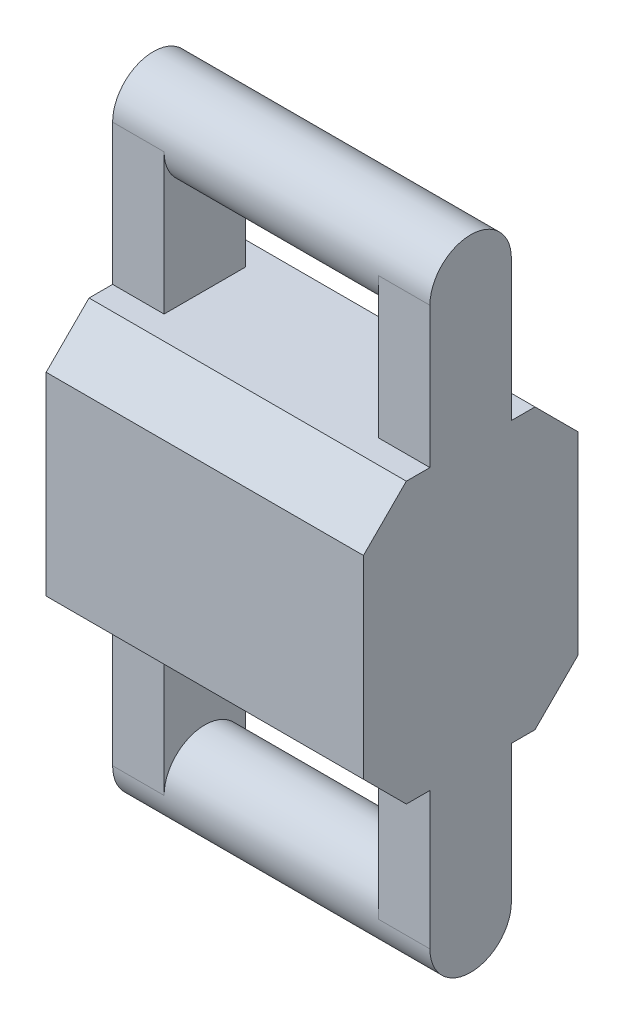
ISO-10303-21;
HEADER;
FILE_DESCRIPTION(('STEP AP214'),'2;1');
FILE_NAME('part.step','',(''),(''),'','','');
FILE_SCHEMA(('AUTOMOTIVE_DESIGN { 1 0 10303 214 1 1 1 1 }'));
ENDSEC;
DATA;
#1=APPLICATION_CONTEXT('core data for automotive mechanical design processes');
#2=APPLICATION_PROTOCOL_DEFINITION('international standard','automotive_design',2000,#1);
#3=PRODUCT_CONTEXT('',#1,'mechanical');
#4=PRODUCT('Part','Part','',(#3));
#5=PRODUCT_RELATED_PRODUCT_CATEGORY('part','',(#4));
#6=PRODUCT_DEFINITION_FORMATION('','',#4);
#7=PRODUCT_DEFINITION_CONTEXT('part definition',#1,'design');
#8=PRODUCT_DEFINITION('design','',#6,#7);
#9=PRODUCT_DEFINITION_SHAPE('','',#8);
#10=(LENGTH_UNIT() NAMED_UNIT(*) SI_UNIT(.MILLI.,.METRE.));
#11=(NAMED_UNIT(*) PLANE_ANGLE_UNIT() SI_UNIT($,.RADIAN.));
#12=(NAMED_UNIT(*) SI_UNIT($,.STERADIAN.) SOLID_ANGLE_UNIT());
#13=UNCERTAINTY_MEASURE_WITH_UNIT(LENGTH_MEASURE(1.E-05),#10,'distance_accuracy_value','');
#14=(GEOMETRIC_REPRESENTATION_CONTEXT(3) GLOBAL_UNCERTAINTY_ASSIGNED_CONTEXT((#13)) GLOBAL_UNIT_ASSIGNED_CONTEXT((#10,
#11,#12)) REPRESENTATION_CONTEXT('',''));
#15=CARTESIAN_POINT('',(0.,0.,0.));
#16=DIRECTION('',(0.,0.,1.));
#17=DIRECTION('',(1.,0.,0.));
#18=AXIS2_PLACEMENT_3D('',#15,#16,#17);
#19=CARTESIAN_POINT('',(5.,0.,3.1));
#20=DIRECTION('',(0.,0.,1.));
#21=DIRECTION('',(1.,0.,0.));
#22=AXIS2_PLACEMENT_3D('',#19,#20,#21);
#23=PLANE('',#22);
#24=DIRECTION('',(0.,1.,0.));
#25=VECTOR('',#24,1.);
#26=CARTESIAN_POINT('',(-5.,0.,3.1));
#27=LINE('',#26,#25);
#28=CARTESIAN_POINT('',(-5.,0.,3.1));
#29=VERTEX_POINT('',#28);
#30=CARTESIAN_POINT('',(-5.,6.40324153852321,3.1));
#31=VERTEX_POINT('',#30);
#32=EDGE_CURVE('E621',#29,#31,#27,.T.);
#33=ORIENTED_EDGE('',*,*,#32,.F.);
#34=DIRECTION('',(1.,0.,0.));
#35=VECTOR('',#34,1.);
#36=CARTESIAN_POINT('',(-7.4,0.,3.1));
#37=LINE('',#36,#35);
#38=CARTESIAN_POINT('',(-7.4,0.,3.1));
#39=VERTEX_POINT('',#38);
#40=EDGE_CURVE('E441',#39,#29,#37,.T.);
#41=ORIENTED_EDGE('',*,*,#40,.F.);
#42=DIRECTION('',(0.,-1.,0.));
#43=VECTOR('',#42,1.);
#44=CARTESIAN_POINT('',(-7.4,6.40324153852321,3.1));
#45=LINE('',#44,#43);
#46=CARTESIAN_POINT('',(-7.4,6.40324153852321,3.1));
#47=VERTEX_POINT('',#46);
#48=EDGE_CURVE('E402',#47,#39,#45,.T.);
#49=ORIENTED_EDGE('',*,*,#48,.F.);
#50=DIRECTION('',(-1.,0.,0.));
#51=VECTOR('',#50,1.);
#52=CARTESIAN_POINT('',(-2.6,6.40324153852321,3.1));
#53=LINE('',#52,#51);
#54=EDGE_CURVE('E449',#31,#47,#53,.T.);
#55=ORIENTED_EDGE('',*,*,#54,.F.);
#56=EDGE_LOOP('',(#33,#41,#49,#55));
#57=FACE_BOUND('',#56,.T.);
#58=ADVANCED_FACE('F108',(#57),#23,.F.);
#59=CARTESIAN_POINT('',(5.,0.,6.9));
#60=DIRECTION('',(0.,0.,-1.));
#61=DIRECTION('',(-1.,0.,0.));
#62=AXIS2_PLACEMENT_3D('',#59,#60,#61);
#63=PLANE('',#62);
#64=DIRECTION('',(0.,-1.,0.));
#65=VECTOR('',#64,1.);
#66=CARTESIAN_POINT('',(-5.,26.,6.9));
#67=LINE('',#66,#65);
#68=CARTESIAN_POINT('',(-5.,26.,6.9));
#69=VERTEX_POINT('',#68);
#70=CARTESIAN_POINT('',(-5.,19.4450929238287,6.9));
#71=VERTEX_POINT('',#70);
#72=EDGE_CURVE('E650',#69,#71,#67,.T.);
#73=ORIENTED_EDGE('',*,*,#72,.F.);
#74=DIRECTION('',(1.,0.,0.));
#75=VECTOR('',#74,1.);
#76=CARTESIAN_POINT('',(-7.4,26.,6.9));
#77=LINE('',#76,#75);
#78=CARTESIAN_POINT('',(-7.4,26.,6.9));
#79=VERTEX_POINT('',#78);
#80=EDGE_CURVE('E433',#79,#69,#77,.T.);
#81=ORIENTED_EDGE('',*,*,#80,.F.);
#82=DIRECTION('',(0.,1.,0.));
#83=VECTOR('',#82,1.);
#84=CARTESIAN_POINT('',(-7.4,19.4450929238287,6.9));
#85=LINE('',#84,#83);
#86=CARTESIAN_POINT('',(-7.4,19.4450929238287,6.9));
#87=VERTEX_POINT('',#86);
#88=EDGE_CURVE('E125',#87,#79,#85,.T.);
#89=ORIENTED_EDGE('',*,*,#88,.F.);
#90=DIRECTION('',(-1.,0.,0.));
#91=VECTOR('',#90,1.);
#92=CARTESIAN_POINT('',(-2.6,19.4450929238287,6.9));
#93=LINE('',#92,#91);
#94=EDGE_CURVE('E133',#71,#87,#93,.T.);
#95=ORIENTED_EDGE('',*,*,#94,.F.);
#96=EDGE_LOOP('',(#73,#81,#89,#95));
#97=FACE_BOUND('',#96,.T.);
#98=ADVANCED_FACE('F564',(#97),#63,.F.);
#99=CARTESIAN_POINT('',(5.,0.,6.9));
#100=DIRECTION('',(0.,0.,1.));
#101=DIRECTION('',(1.,0.,0.));
#102=AXIS2_PLACEMENT_3D('',#99,#100,#101);
#103=PLANE('',#102);
#104=DIRECTION('',(1.,0.,0.));
#105=VECTOR('',#104,1.);
#106=CARTESIAN_POINT('',(-7.4,0.,6.9));
#107=LINE('',#106,#105);
#108=CARTESIAN_POINT('',(-7.4,0.,6.9));
#109=VERTEX_POINT('',#108);
#110=CARTESIAN_POINT('',(-5.,0.,6.9));
#111=VERTEX_POINT('',#110);
#112=EDGE_CURVE('E437',#109,#111,#107,.T.);
#113=ORIENTED_EDGE('',*,*,#112,.T.);
#114=DIRECTION('',(0.,-1.,0.));
#115=VECTOR('',#114,1.);
#116=CARTESIAN_POINT('',(-5.,6.40324153852321,6.9));
#117=LINE('',#116,#115);
#118=CARTESIAN_POINT('',(-5.,6.40324153852321,6.9));
#119=VERTEX_POINT('',#118);
#120=EDGE_CURVE('E624',#119,#111,#117,.T.);
#121=ORIENTED_EDGE('',*,*,#120,.F.);
#122=DIRECTION('',(1.,0.,0.));
#123=VECTOR('',#122,1.);
#124=CARTESIAN_POINT('',(-5.,6.40324153852321,6.9));
#125=LINE('',#124,#123);
#126=CARTESIAN_POINT('',(-7.4,6.40324153852321,6.9));
#127=VERTEX_POINT('',#126);
#128=EDGE_CURVE('E453',#127,#119,#125,.T.);
#129=ORIENTED_EDGE('',*,*,#128,.F.);
#130=DIRECTION('',(0.,1.,0.));
#131=VECTOR('',#130,1.);
#132=CARTESIAN_POINT('',(-7.4,0.,6.9));
#133=LINE('',#132,#131);
#134=EDGE_CURVE('E408',#109,#127,#133,.T.);
#135=ORIENTED_EDGE('',*,*,#134,.F.);
#136=EDGE_LOOP('',(#113,#121,#129,#135));
#137=FACE_BOUND('',#136,.T.);
#138=ADVANCED_FACE('F571',(#137),#103,.T.);
#139=CARTESIAN_POINT('',(5.,0.,3.1));
#140=DIRECTION('',(0.,0.,-1.));
#141=DIRECTION('',(-1.,0.,0.));
#142=AXIS2_PLACEMENT_3D('',#139,#140,#141);
#143=PLANE('',#142);
#144=DIRECTION('',(1.,0.,0.));
#145=VECTOR('',#144,1.);
#146=CARTESIAN_POINT('',(-7.4,26.,3.1));
#147=LINE('',#146,#145);
#148=CARTESIAN_POINT('',(-7.4,26.,3.1));
#149=VERTEX_POINT('',#148);
#150=CARTESIAN_POINT('',(-5.,26.,3.1));
#151=VERTEX_POINT('',#150);
#152=EDGE_CURVE('E445',#149,#151,#147,.T.);
#153=ORIENTED_EDGE('',*,*,#152,.T.);
#154=DIRECTION('',(0.,1.,0.));
#155=VECTOR('',#154,1.);
#156=CARTESIAN_POINT('',(-5.,19.4450929238287,3.1));
#157=LINE('',#156,#155);
#158=CARTESIAN_POINT('',(-5.,19.4450929238287,3.1));
#159=VERTEX_POINT('',#158);
#160=EDGE_CURVE('E643',#159,#151,#157,.T.);
#161=ORIENTED_EDGE('',*,*,#160,.F.);
#162=DIRECTION('',(1.,0.,0.));
#163=VECTOR('',#162,1.);
#164=CARTESIAN_POINT('',(-5.,19.4450929238287,3.1));
#165=LINE('',#164,#163);
#166=CARTESIAN_POINT('',(-7.4,19.4450929238287,3.1));
#167=VERTEX_POINT('',#166);
#168=EDGE_CURVE('E464',#167,#159,#165,.T.);
#169=ORIENTED_EDGE('',*,*,#168,.F.);
#170=DIRECTION('',(0.,-1.,0.));
#171=VECTOR('',#170,1.);
#172=CARTESIAN_POINT('',(-7.4,26.,3.1));
#173=LINE('',#172,#171);
#174=EDGE_CURVE('E378',#149,#167,#173,.T.);
#175=ORIENTED_EDGE('',*,*,#174,.F.);
#176=EDGE_LOOP('',(#153,#161,#169,#175));
#177=FACE_BOUND('',#176,.T.);
#178=ADVANCED_FACE('F577',(#177),#143,.T.);
#179=DIRECTION('',(0.,-1.,0.));
#180=VECTOR('',#179,1.);
#181=CARTESIAN_POINT('',(5.,6.40324153852321,3.1));
#182=LINE('',#181,#180);
#183=CARTESIAN_POINT('',(5.,6.40324153852321,3.1));
#184=VERTEX_POINT('',#183);
#185=CARTESIAN_POINT('',(5.,0.,3.1));
#186=VERTEX_POINT('',#185);
#187=EDGE_CURVE('E311',#184,#186,#182,.T.);
#188=ORIENTED_EDGE('',*,*,#187,.F.);
#189=DIRECTION('',(-1.,0.,0.));
#190=VECTOR('',#189,1.);
#191=CARTESIAN_POINT('',(5.,6.40324153852321,3.1));
#192=LINE('',#191,#190);
#193=CARTESIAN_POINT('',(7.4,6.40324153852321,3.1));
#194=VERTEX_POINT('',#193);
#195=EDGE_CURVE('E454',#194,#184,#192,.T.);
#196=ORIENTED_EDGE('',*,*,#195,.F.);
#197=DIRECTION('',(0.,1.,0.));
#198=VECTOR('',#197,1.);
#199=CARTESIAN_POINT('',(7.4,0.,3.1));
#200=LINE('',#199,#198);
#201=CARTESIAN_POINT('',(7.4,0.,3.1));
#202=VERTEX_POINT('',#201);
#203=EDGE_CURVE('E341',#202,#194,#200,.T.);
#204=ORIENTED_EDGE('',*,*,#203,.F.);
#205=DIRECTION('',(-1.,0.,0.));
#206=VECTOR('',#205,1.);
#207=CARTESIAN_POINT('',(7.4,0.,3.1));
#208=LINE('',#207,#206);
#209=EDGE_CURVE('E286',#202,#186,#208,.T.);
#210=ORIENTED_EDGE('',*,*,#209,.T.);
#211=EDGE_LOOP('',(#188,#196,#204,#210));
#212=FACE_BOUND('',#211,.T.);
#213=ADVANCED_FACE('F513',(#212),#23,.F.);
#214=DIRECTION('',(0.,1.,0.));
#215=VECTOR('',#214,1.);
#216=CARTESIAN_POINT('',(5.,19.4450929238287,6.9));
#217=LINE('',#216,#215);
#218=CARTESIAN_POINT('',(5.,19.4450929238287,6.9));
#219=VERTEX_POINT('',#218);
#220=CARTESIAN_POINT('',(5.,26.,6.9));
#221=VERTEX_POINT('',#220);
#222=EDGE_CURVE('E295',#219,#221,#217,.T.);
#223=ORIENTED_EDGE('',*,*,#222,.F.);
#224=DIRECTION('',(-1.,0.,0.));
#225=VECTOR('',#224,1.);
#226=CARTESIAN_POINT('',(5.,19.4450929238287,6.9));
#227=LINE('',#226,#225);
#228=CARTESIAN_POINT('',(7.4,19.4450929238287,6.9));
#229=VERTEX_POINT('',#228);
#230=EDGE_CURVE('E458',#229,#219,#227,.T.);
#231=ORIENTED_EDGE('',*,*,#230,.F.);
#232=DIRECTION('',(0.,-1.,0.));
#233=VECTOR('',#232,1.);
#234=CARTESIAN_POINT('',(7.4,26.,6.9));
#235=LINE('',#234,#233);
#236=CARTESIAN_POINT('',(7.4,26.,6.9));
#237=VERTEX_POINT('',#236);
#238=EDGE_CURVE('E310',#237,#229,#235,.T.);
#239=ORIENTED_EDGE('',*,*,#238,.F.);
#240=DIRECTION('',(-1.,0.,0.));
#241=VECTOR('',#240,1.);
#242=CARTESIAN_POINT('',(7.4,26.,6.9));
#243=LINE('',#242,#241);
#244=EDGE_CURVE('E372',#237,#221,#243,.T.);
#245=ORIENTED_EDGE('',*,*,#244,.T.);
#246=EDGE_LOOP('',(#223,#231,#239,#245));
#247=FACE_BOUND('',#246,.T.);
#248=ADVANCED_FACE('F550',(#247),#63,.F.);
#249=DIRECTION('',(1.,0.,0.));
#250=VECTOR('',#249,1.);
#251=CARTESIAN_POINT('',(2.6,6.40324153852321,6.9));
#252=LINE('',#251,#250);
#253=CARTESIAN_POINT('',(5.,6.40324153852321,6.9));
#254=VERTEX_POINT('',#253);
#255=CARTESIAN_POINT('',(7.4,6.40324153852321,6.9));
#256=VERTEX_POINT('',#255);
#257=EDGE_CURVE('E450',#254,#256,#252,.T.);
#258=ORIENTED_EDGE('',*,*,#257,.F.);
#259=DIRECTION('',(0.,1.,0.));
#260=VECTOR('',#259,1.);
#261=CARTESIAN_POINT('',(5.,0.,6.9));
#262=LINE('',#261,#260);
#263=CARTESIAN_POINT('',(5.,0.,6.9));
#264=VERTEX_POINT('',#263);
#265=EDGE_CURVE('E522',#264,#254,#262,.T.);
#266=ORIENTED_EDGE('',*,*,#265,.F.);
#267=DIRECTION('',(-1.,0.,0.));
#268=VECTOR('',#267,1.);
#269=CARTESIAN_POINT('',(7.4,0.,6.9));
#270=LINE('',#269,#268);
#271=CARTESIAN_POINT('',(7.4,0.,6.9));
#272=VERTEX_POINT('',#271);
#273=EDGE_CURVE('E369',#272,#264,#270,.T.);
#274=ORIENTED_EDGE('',*,*,#273,.F.);
#275=DIRECTION('',(0.,-1.,0.));
#276=VECTOR('',#275,1.);
#277=CARTESIAN_POINT('',(7.4,6.40324153852321,6.9));
#278=LINE('',#277,#276);
#279=EDGE_CURVE('E335',#256,#272,#278,.T.);
#280=ORIENTED_EDGE('',*,*,#279,.F.);
#281=EDGE_LOOP('',(#258,#266,#274,#280));
#282=FACE_BOUND('',#281,.T.);
#283=ADVANCED_FACE('F532',(#282),#103,.T.);
#284=DIRECTION('',(1.,0.,0.));
#285=VECTOR('',#284,1.);
#286=CARTESIAN_POINT('',(2.6,19.4450929238287,3.1));
#287=LINE('',#286,#285);
#288=CARTESIAN_POINT('',(5.,19.4450929238287,3.1));
#289=VERTEX_POINT('',#288);
#290=CARTESIAN_POINT('',(7.4,19.4450929238287,3.1));
#291=VERTEX_POINT('',#290);
#292=EDGE_CURVE('E300',#289,#291,#287,.T.);
#293=ORIENTED_EDGE('',*,*,#292,.F.);
#294=DIRECTION('',(0.,-1.,0.));
#295=VECTOR('',#294,1.);
#296=CARTESIAN_POINT('',(5.,26.,3.1));
#297=LINE('',#296,#295);
#298=CARTESIAN_POINT('',(5.,26.,3.1));
#299=VERTEX_POINT('',#298);
#300=EDGE_CURVE('E292',#299,#289,#297,.T.);
#301=ORIENTED_EDGE('',*,*,#300,.F.);
#302=DIRECTION('',(-1.,0.,0.));
#303=VECTOR('',#302,1.);
#304=CARTESIAN_POINT('',(7.4,26.,3.1));
#305=LINE('',#304,#303);
#306=CARTESIAN_POINT('',(7.4,26.,3.1));
#307=VERTEX_POINT('',#306);
#308=EDGE_CURVE('E273',#307,#299,#305,.T.);
#309=ORIENTED_EDGE('',*,*,#308,.F.);
#310=DIRECTION('',(0.,1.,0.));
#311=VECTOR('',#310,1.);
#312=CARTESIAN_POINT('',(7.4,19.4450929238287,3.1));
#313=LINE('',#312,#311);
#314=EDGE_CURVE('E287',#291,#307,#313,.T.);
#315=ORIENTED_EDGE('',*,*,#314,.F.);
#316=EDGE_LOOP('',(#293,#301,#309,#315));
#317=FACE_BOUND('',#316,.T.);
#318=ADVANCED_FACE('F299',(#317),#143,.T.);
#319=CARTESIAN_POINT('',(0.,0.,0.));
#320=DIRECTION('',(0.,0.,1.));
#321=DIRECTION('',(1.,0.,0.));
#322=AXIS2_PLACEMENT_3D('',#319,#320,#321);
#323=PLANE('',#322);
#324=DIRECTION('',(-1.,0.,0.));
#325=VECTOR('',#324,1.);
#326=CARTESIAN_POINT('',(0.,8.40324153852322,0.));
#327=LINE('',#326,#325);
#328=CARTESIAN_POINT('',(7.4,8.40324153852321,0.));
#329=VERTEX_POINT('',#328);
#330=CARTESIAN_POINT('',(-7.4,8.40324153852321,0.));
#331=VERTEX_POINT('',#330);
#332=EDGE_CURVE('E118',#329,#331,#327,.T.);
#333=ORIENTED_EDGE('',*,*,#332,.T.);
#334=DIRECTION('',(0.,-1.,0.));
#335=VECTOR('',#334,1.);
#336=CARTESIAN_POINT('',(-7.4,17.4450929238286,0.));
#337=LINE('',#336,#335);
#338=CARTESIAN_POINT('',(-7.4,17.4450929238286,0.));
#339=VERTEX_POINT('',#338);
#340=EDGE_CURVE('E390',#339,#331,#337,.T.);
#341=ORIENTED_EDGE('',*,*,#340,.F.);
#342=DIRECTION('',(1.,0.,0.));
#343=VECTOR('',#342,1.);
#344=CARTESIAN_POINT('',(5.,17.4450929238286,0.));
#345=LINE('',#344,#343);
#346=CARTESIAN_POINT('',(7.4,17.4450929238286,0.));
#347=VERTEX_POINT('',#346);
#348=EDGE_CURVE('E12',#339,#347,#345,.T.);
#349=ORIENTED_EDGE('',*,*,#348,.T.);
#350=DIRECTION('',(0.,1.,0.));
#351=VECTOR('',#350,1.);
#352=CARTESIAN_POINT('',(7.4,8.40324153852321,0.));
#353=LINE('',#352,#351);
#354=EDGE_CURVE('E353',#329,#347,#353,.T.);
#355=ORIENTED_EDGE('',*,*,#354,.F.);
#356=EDGE_LOOP('',(#333,#341,#349,#355));
#357=FACE_BOUND('',#356,.T.);
#358=ADVANCED_FACE('F496',(#357),#323,.F.);
#359=CARTESIAN_POINT('',(0.,0.,10.));
#360=DIRECTION('',(0.,0.,1.));
#361=DIRECTION('',(1.,0.,0.));
#362=AXIS2_PLACEMENT_3D('',#359,#360,#361);
#363=PLANE('',#362);
#364=DIRECTION('',(-1.,0.,0.));
#365=VECTOR('',#364,1.);
#366=CARTESIAN_POINT('',(0.,17.4450929238286,10.));
#367=LINE('',#366,#365);
#368=CARTESIAN_POINT('',(7.4,17.4450929238286,10.));
#369=VERTEX_POINT('',#368);
#370=CARTESIAN_POINT('',(-7.4,17.4450929238286,10.));
#371=VERTEX_POINT('',#370);
#372=EDGE_CURVE('E481',#369,#371,#367,.T.);
#373=ORIENTED_EDGE('',*,*,#372,.T.);
#374=DIRECTION('',(0.,1.,0.));
#375=VECTOR('',#374,1.);
#376=CARTESIAN_POINT('',(-7.4,8.40324153852321,10.));
#377=LINE('',#376,#375);
#378=CARTESIAN_POINT('',(-7.4,8.40324153852321,10.));
#379=VERTEX_POINT('',#378);
#380=EDGE_CURVE('E420',#379,#371,#377,.T.);
#381=ORIENTED_EDGE('',*,*,#380,.F.);
#382=DIRECTION('',(1.,0.,0.));
#383=VECTOR('',#382,1.);
#384=CARTESIAN_POINT('',(5.,8.40324153852322,10.));
#385=LINE('',#384,#383);
#386=CARTESIAN_POINT('',(7.4,8.40324153852321,10.));
#387=VERTEX_POINT('',#386);
#388=EDGE_CURVE('E484',#379,#387,#385,.T.);
#389=ORIENTED_EDGE('',*,*,#388,.T.);
#390=DIRECTION('',(0.,-1.,0.));
#391=VECTOR('',#390,1.);
#392=CARTESIAN_POINT('',(7.4,17.4450929238286,10.));
#393=LINE('',#392,#391);
#394=EDGE_CURVE('E323',#369,#387,#393,.T.);
#395=ORIENTED_EDGE('',*,*,#394,.F.);
#396=EDGE_LOOP('',(#373,#381,#389,#395));
#397=FACE_BOUND('',#396,.T.);
#398=ADVANCED_FACE('F542',(#397),#363,.T.);
#399=CARTESIAN_POINT('',(5.002,0.,5.));
#400=DIRECTION('',(-1.,0.,0.));
#401=DIRECTION('',(0.,0.,1.));
#402=AXIS2_PLACEMENT_3D('',#399,#400,#401);
#403=CYLINDRICAL_SURFACE('',#402,1.9);
#404=CARTESIAN_POINT('',(-5.,0.,5.));
#405=DIRECTION('',(-1.,0.,0.));
#406=DIRECTION('',(0.,0.,-1.));
#407=AXIS2_PLACEMENT_3D('',#404,#405,#406);
#408=CIRCLE('',#407,1.9);
#409=EDGE_CURVE('E620',#111,#29,#408,.T.);
#410=ORIENTED_EDGE('',*,*,#409,.F.);
#411=ORIENTED_EDGE('',*,*,#112,.F.);
#412=CARTESIAN_POINT('',(-7.4,0.,5.));
#413=DIRECTION('',(-1.,0.,0.));
#414=DIRECTION('',(0.,0.,1.));
#415=AXIS2_PLACEMENT_3D('',#412,#413,#414);
#416=CIRCLE('',#415,1.9);
#417=EDGE_CURVE('E405',#39,#109,#416,.T.);
#418=ORIENTED_EDGE('',*,*,#417,.F.);
#419=ORIENTED_EDGE('',*,*,#40,.T.);
#420=EDGE_LOOP('',(#410,#411,#418,#419));
#421=FACE_BOUND('',#420,.T.);
#422=CARTESIAN_POINT('',(5.,0.,5.));
#423=DIRECTION('',(1.,0.,0.));
#424=DIRECTION('',(0.,0.,1.));
#425=AXIS2_PLACEMENT_3D('',#422,#423,#424);
#426=CIRCLE('',#425,1.9);
#427=EDGE_CURVE('E297',#186,#264,#426,.T.);
#428=ORIENTED_EDGE('',*,*,#427,.F.);
#429=ORIENTED_EDGE('',*,*,#209,.F.);
#430=CARTESIAN_POINT('',(7.4,0.,5.));
#431=DIRECTION('',(1.,0.,0.));
#432=DIRECTION('',(0.,0.,-1.));
#433=AXIS2_PLACEMENT_3D('',#430,#431,#432);
#434=CIRCLE('',#433,1.9);
#435=EDGE_CURVE('E338',#272,#202,#434,.T.);
#436=ORIENTED_EDGE('',*,*,#435,.F.);
#437=ORIENTED_EDGE('',*,*,#273,.T.);
#438=EDGE_LOOP('',(#428,#429,#436,#437));
#439=FACE_BOUND('',#438,.T.);
#440=ADVANCED_FACE('F636',(#421,#439),#403,.T.);
#441=CARTESIAN_POINT('',(-5.002,26.,5.));
#442=DIRECTION('',(1.,0.,0.));
#443=DIRECTION('',(0.,0.,-1.));
#444=AXIS2_PLACEMENT_3D('',#441,#442,#443);
#445=CYLINDRICAL_SURFACE('',#444,1.9);
#446=CARTESIAN_POINT('',(5.,26.,5.));
#447=DIRECTION('',(1.,0.,0.));
#448=DIRECTION('',(0.,0.,1.));
#449=AXIS2_PLACEMENT_3D('',#446,#447,#448);
#450=CIRCLE('',#449,1.9);
#451=EDGE_CURVE('E278',#221,#299,#450,.T.);
#452=ORIENTED_EDGE('',*,*,#451,.F.);
#453=ORIENTED_EDGE('',*,*,#244,.F.);
#454=CARTESIAN_POINT('',(7.4,26.,5.));
#455=DIRECTION('',(1.,0.,0.));
#456=DIRECTION('',(0.,0.,-1.));
#457=AXIS2_PLACEMENT_3D('',#454,#455,#456);
#458=CIRCLE('',#457,1.9);
#459=EDGE_CURVE('E281',#307,#237,#458,.T.);
#460=ORIENTED_EDGE('',*,*,#459,.F.);
#461=ORIENTED_EDGE('',*,*,#308,.T.);
#462=EDGE_LOOP('',(#452,#453,#460,#461));
#463=FACE_BOUND('',#462,.T.);
#464=CARTESIAN_POINT('',(-5.,26.,5.));
#465=DIRECTION('',(-1.,0.,0.));
#466=DIRECTION('',(0.,0.,-1.));
#467=AXIS2_PLACEMENT_3D('',#464,#465,#466);
#468=CIRCLE('',#467,1.9);
#469=EDGE_CURVE('E628',#151,#69,#468,.T.);
#470=ORIENTED_EDGE('',*,*,#469,.F.);
#471=ORIENTED_EDGE('',*,*,#152,.F.);
#472=CARTESIAN_POINT('',(-7.4,26.,5.));
#473=DIRECTION('',(-1.,0.,0.));
#474=DIRECTION('',(0.,0.,1.));
#475=AXIS2_PLACEMENT_3D('',#472,#473,#474);
#476=CIRCLE('',#475,1.9);
#477=EDGE_CURVE('E375',#79,#149,#476,.T.);
#478=ORIENTED_EDGE('',*,*,#477,.F.);
#479=ORIENTED_EDGE('',*,*,#80,.T.);
#480=EDGE_LOOP('',(#470,#471,#478,#479));
#481=FACE_BOUND('',#480,.T.);
#482=ADVANCED_FACE('F275',(#463,#481),#445,.T.);
#483=CARTESIAN_POINT('',(0.,19.4450929238287,0.));
#484=DIRECTION('',(0.,1.,0.));
#485=DIRECTION('',(0.,0.,1.));
#486=AXIS2_PLACEMENT_3D('',#483,#484,#485);
#487=PLANE('',#486);
#488=DIRECTION('',(0.,0.,-1.));
#489=VECTOR('',#488,1.);
#490=CARTESIAN_POINT('',(-5.,19.4450929238287,6.9));
#491=LINE('',#490,#489);
#492=EDGE_CURVE('E647',#71,#159,#491,.T.);
#493=ORIENTED_EDGE('',*,*,#492,.F.);
#494=ORIENTED_EDGE('',*,*,#94,.T.);
#495=DIRECTION('',(0.,0.,-1.));
#496=VECTOR('',#495,1.);
#497=CARTESIAN_POINT('',(-7.4,19.4450929238287,8.));
#498=LINE('',#497,#496);
#499=CARTESIAN_POINT('',(-7.4,19.4450929238287,8.));
#500=VERTEX_POINT('',#499);
#501=EDGE_CURVE('E428',#500,#87,#498,.T.);
#502=ORIENTED_EDGE('',*,*,#501,.F.);
#503=DIRECTION('',(1.,0.,0.));
#504=VECTOR('',#503,1.);
#505=CARTESIAN_POINT('',(0.,19.4450929238287,8.));
#506=LINE('',#505,#504);
#507=CARTESIAN_POINT('',(7.4,19.4450929238287,8.));
#508=VERTEX_POINT('',#507);
#509=EDGE_CURVE('E490',#500,#508,#506,.T.);
#510=ORIENTED_EDGE('',*,*,#509,.T.);
#511=DIRECTION('',(0.,0.,1.));
#512=VECTOR('',#511,1.);
#513=CARTESIAN_POINT('',(7.4,19.4450929238287,6.9));
#514=LINE('',#513,#512);
#515=EDGE_CURVE('E315',#229,#508,#514,.T.);
#516=ORIENTED_EDGE('',*,*,#515,.F.);
#517=ORIENTED_EDGE('',*,*,#230,.T.);
#518=DIRECTION('',(0.,0.,1.));
#519=VECTOR('',#518,1.);
#520=CARTESIAN_POINT('',(5.,19.4450929238287,3.1));
#521=LINE('',#520,#519);
#522=EDGE_CURVE('E302',#289,#219,#521,.T.);
#523=ORIENTED_EDGE('',*,*,#522,.F.);
#524=ORIENTED_EDGE('',*,*,#292,.T.);
#525=DIRECTION('',(0.,0.,1.));
#526=VECTOR('',#525,1.);
#527=CARTESIAN_POINT('',(7.4,19.4450929238287,2.));
#528=LINE('',#527,#526);
#529=CARTESIAN_POINT('',(7.4,19.4450929238287,2.));
#530=VERTEX_POINT('',#529);
#531=EDGE_CURVE('E361',#530,#291,#528,.T.);
#532=ORIENTED_EDGE('',*,*,#531,.F.);
#533=DIRECTION('',(-1.,0.,0.));
#534=VECTOR('',#533,1.);
#535=CARTESIAN_POINT('',(-5.,19.4450929238287,2.));
#536=LINE('',#535,#534);
#537=CARTESIAN_POINT('',(-7.4,19.4450929238287,2.));
#538=VERTEX_POINT('',#537);
#539=EDGE_CURVE('E487',#530,#538,#536,.T.);
#540=ORIENTED_EDGE('',*,*,#539,.T.);
#541=DIRECTION('',(0.,0.,-1.));
#542=VECTOR('',#541,1.);
#543=CARTESIAN_POINT('',(-7.4,19.4450929238287,3.1));
#544=LINE('',#543,#542);
#545=EDGE_CURVE('E382',#167,#538,#544,.T.);
#546=ORIENTED_EDGE('',*,*,#545,.F.);
#547=ORIENTED_EDGE('',*,*,#168,.T.);
#548=EDGE_LOOP('',(#493,#494,#502,#510,#516,#517,#523,#524,#532,#540,#546,#547));
#549=FACE_BOUND('',#548,.T.);
#550=ADVANCED_FACE('F548',(#549),#487,.T.);
#551=CARTESIAN_POINT('',(0.,6.40324153852321,0.));
#552=DIRECTION('',(0.,1.,0.));
#553=DIRECTION('',(-1.,0.,0.));
#554=AXIS2_PLACEMENT_3D('',#551,#552,#553);
#555=PLANE('',#554);
#556=DIRECTION('',(0.,0.,1.));
#557=VECTOR('',#556,1.);
#558=CARTESIAN_POINT('',(-5.,6.40324153852321,3.1));
#559=LINE('',#558,#557);
#560=EDGE_CURVE('E634',#31,#119,#559,.T.);
#561=ORIENTED_EDGE('',*,*,#560,.F.);
#562=ORIENTED_EDGE('',*,*,#54,.T.);
#563=DIRECTION('',(0.,0.,1.));
#564=VECTOR('',#563,1.);
#565=CARTESIAN_POINT('',(-7.4,6.40324153852321,2.));
#566=LINE('',#565,#564);
#567=CARTESIAN_POINT('',(-7.4,6.40324153852321,2.));
#568=VERTEX_POINT('',#567);
#569=EDGE_CURVE('E398',#568,#47,#566,.T.);
#570=ORIENTED_EDGE('',*,*,#569,.F.);
#571=DIRECTION('',(1.,0.,0.));
#572=VECTOR('',#571,1.);
#573=CARTESIAN_POINT('',(0.,6.40324153852321,2.));
#574=LINE('',#573,#572);
#575=CARTESIAN_POINT('',(7.4,6.40324153852321,2.));
#576=VERTEX_POINT('',#575);
#577=EDGE_CURVE('E470',#568,#576,#574,.T.);
#578=ORIENTED_EDGE('',*,*,#577,.T.);
#579=DIRECTION('',(0.,0.,-1.));
#580=VECTOR('',#579,1.);
#581=CARTESIAN_POINT('',(7.4,6.40324153852321,3.1));
#582=LINE('',#581,#580);
#583=EDGE_CURVE('E345',#194,#576,#582,.T.);
#584=ORIENTED_EDGE('',*,*,#583,.F.);
#585=ORIENTED_EDGE('',*,*,#195,.T.);
#586=DIRECTION('',(0.,0.,-1.));
#587=VECTOR('',#586,1.);
#588=CARTESIAN_POINT('',(5.,6.40324153852321,6.9));
#589=LINE('',#588,#587);
#590=EDGE_CURVE('E516',#254,#184,#589,.T.);
#591=ORIENTED_EDGE('',*,*,#590,.F.);
#592=ORIENTED_EDGE('',*,*,#257,.T.);
#593=DIRECTION('',(0.,0.,-1.));
#594=VECTOR('',#593,1.);
#595=CARTESIAN_POINT('',(7.4,6.40324153852321,8.));
#596=LINE('',#595,#594);
#597=CARTESIAN_POINT('',(7.4,6.40324153852321,8.));
#598=VERTEX_POINT('',#597);
#599=EDGE_CURVE('E331',#598,#256,#596,.T.);
#600=ORIENTED_EDGE('',*,*,#599,.F.);
#601=DIRECTION('',(-1.,0.,0.));
#602=VECTOR('',#601,1.);
#603=CARTESIAN_POINT('',(-5.,6.40324153852321,8.));
#604=LINE('',#603,#602);
#605=CARTESIAN_POINT('',(-7.4,6.40324153852321,8.));
#606=VERTEX_POINT('',#605);
#607=EDGE_CURVE('E478',#598,#606,#604,.T.);
#608=ORIENTED_EDGE('',*,*,#607,.T.);
#609=DIRECTION('',(0.,0.,1.));
#610=VECTOR('',#609,1.);
#611=CARTESIAN_POINT('',(-7.4,6.40324153852321,6.9));
#612=LINE('',#611,#610);
#613=EDGE_CURVE('E412',#127,#606,#612,.T.);
#614=ORIENTED_EDGE('',*,*,#613,.F.);
#615=ORIENTED_EDGE('',*,*,#128,.T.);
#616=EDGE_LOOP('',(#561,#562,#570,#578,#584,#585,#591,#592,#600,#608,#614,#615));
#617=FACE_BOUND('',#616,.T.);
#618=ADVANCED_FACE('F505',(#617),#555,.F.);
#619=CARTESIAN_POINT('',(0.,6.40324153852321,8.));
#620=DIRECTION('',(0.,-0.707106781186546,0.707106781186549));
#621=DIRECTION('',(1.,0.,0.));
#622=AXIS2_PLACEMENT_3D('',#619,#620,#621);
#623=PLANE('',#622);
#624=ORIENTED_EDGE('',*,*,#607,.F.);
#625=DIRECTION('',(0.,-0.707106781186548,-0.707106781186547));
#626=VECTOR('',#625,1.);
#627=CARTESIAN_POINT('',(7.4,8.40324153852321,10.));
#628=LINE('',#627,#626);
#629=EDGE_CURVE('E327',#387,#598,#628,.T.);
#630=ORIENTED_EDGE('',*,*,#629,.F.);
#631=ORIENTED_EDGE('',*,*,#388,.F.);
#632=DIRECTION('',(0.,0.707106781186548,0.707106781186547));
#633=VECTOR('',#632,1.);
#634=CARTESIAN_POINT('',(-7.4,6.40324153852321,8.));
#635=LINE('',#634,#633);
#636=EDGE_CURVE('E416',#606,#379,#635,.T.);
#637=ORIENTED_EDGE('',*,*,#636,.F.);
#638=EDGE_LOOP('',(#624,#630,#631,#637));
#639=FACE_BOUND('',#638,.T.);
#640=ADVANCED_FACE('F539',(#639),#623,.T.);
#641=CARTESIAN_POINT('',(0.,19.4450929238287,8.));
#642=DIRECTION('',(0.,-0.707106781186546,-0.707106781186549));
#643=DIRECTION('',(1.,0.,0.));
#644=AXIS2_PLACEMENT_3D('',#641,#642,#643);
#645=PLANE('',#644);
#646=ORIENTED_EDGE('',*,*,#509,.F.);
#647=DIRECTION('',(0.,0.70710678118655,-0.707106781186545));
#648=VECTOR('',#647,1.);
#649=CARTESIAN_POINT('',(-7.4,17.4450929238286,10.));
#650=LINE('',#649,#648);
#651=EDGE_CURVE('E424',#371,#500,#650,.T.);
#652=ORIENTED_EDGE('',*,*,#651,.F.);
#653=ORIENTED_EDGE('',*,*,#372,.F.);
#654=DIRECTION('',(0.,-0.70710678118655,0.707106781186545));
#655=VECTOR('',#654,1.);
#656=CARTESIAN_POINT('',(7.4,19.4450929238287,8.));
#657=LINE('',#656,#655);
#658=EDGE_CURVE('E319',#508,#369,#657,.T.);
#659=ORIENTED_EDGE('',*,*,#658,.F.);
#660=EDGE_LOOP('',(#646,#652,#653,#659));
#661=FACE_BOUND('',#660,.T.);
#662=ADVANCED_FACE('F546',(#661),#645,.F.);
#663=CARTESIAN_POINT('',(0.,19.4450929238287,2.));
#664=DIRECTION('',(0.,0.707106781186546,-0.707106781186549));
#665=DIRECTION('',(1.,0.,0.));
#666=AXIS2_PLACEMENT_3D('',#663,#664,#665);
#667=PLANE('',#666);
#668=ORIENTED_EDGE('',*,*,#539,.F.);
#669=DIRECTION('',(0.,0.70710678118655,0.707106781186545));
#670=VECTOR('',#669,1.);
#671=CARTESIAN_POINT('',(7.4,17.4450929238286,0.));
#672=LINE('',#671,#670);
#673=EDGE_CURVE('E357',#347,#530,#672,.T.);
#674=ORIENTED_EDGE('',*,*,#673,.F.);
#675=ORIENTED_EDGE('',*,*,#348,.F.);
#676=DIRECTION('',(0.,-0.70710678118655,-0.707106781186545));
#677=VECTOR('',#676,1.);
#678=CARTESIAN_POINT('',(-7.4,19.4450929238287,2.));
#679=LINE('',#678,#677);
#680=EDGE_CURVE('E386',#538,#339,#679,.T.);
#681=ORIENTED_EDGE('',*,*,#680,.F.);
#682=EDGE_LOOP('',(#668,#674,#675,#681));
#683=FACE_BOUND('',#682,.T.);
#684=ADVANCED_FACE('F555',(#683),#667,.T.);
#685=CARTESIAN_POINT('',(0.,6.40324153852321,2.));
#686=DIRECTION('',(0.,0.707106781186546,0.707106781186549));
#687=DIRECTION('',(1.,0.,0.));
#688=AXIS2_PLACEMENT_3D('',#685,#686,#687);
#689=PLANE('',#688);
#690=ORIENTED_EDGE('',*,*,#577,.F.);
#691=DIRECTION('',(0.,-0.707106781186548,0.707106781186547));
#692=VECTOR('',#691,1.);
#693=CARTESIAN_POINT('',(-7.4,8.40324153852321,0.));
#694=LINE('',#693,#692);
#695=EDGE_CURVE('E394',#331,#568,#694,.T.);
#696=ORIENTED_EDGE('',*,*,#695,.F.);
#697=ORIENTED_EDGE('',*,*,#332,.F.);
#698=DIRECTION('',(0.,0.707106781186548,-0.707106781186547));
#699=VECTOR('',#698,1.);
#700=CARTESIAN_POINT('',(7.4,6.40324153852321,2.));
#701=LINE('',#700,#699);
#702=EDGE_CURVE('E349',#576,#329,#701,.T.);
#703=ORIENTED_EDGE('',*,*,#702,.F.);
#704=EDGE_LOOP('',(#690,#696,#697,#703));
#705=FACE_BOUND('',#704,.T.);
#706=ADVANCED_FACE('F111',(#705),#689,.F.);
#707=CARTESIAN_POINT('',(-7.4,26.,5.));
#708=DIRECTION('',(-1.,0.,0.));
#709=DIRECTION('',(0.,0.,1.));
#710=AXIS2_PLACEMENT_3D('',#707,#708,#709);
#711=PLANE('',#710);
#712=ORIENTED_EDGE('',*,*,#88,.T.);
#713=ORIENTED_EDGE('',*,*,#477,.T.);
#714=ORIENTED_EDGE('',*,*,#174,.T.);
#715=ORIENTED_EDGE('',*,*,#545,.T.);
#716=ORIENTED_EDGE('',*,*,#680,.T.);
#717=ORIENTED_EDGE('',*,*,#340,.T.);
#718=ORIENTED_EDGE('',*,*,#695,.T.);
#719=ORIENTED_EDGE('',*,*,#569,.T.);
#720=ORIENTED_EDGE('',*,*,#48,.T.);
#721=ORIENTED_EDGE('',*,*,#417,.T.);
#722=ORIENTED_EDGE('',*,*,#134,.T.);
#723=ORIENTED_EDGE('',*,*,#613,.T.);
#724=ORIENTED_EDGE('',*,*,#636,.T.);
#725=ORIENTED_EDGE('',*,*,#380,.T.);
#726=ORIENTED_EDGE('',*,*,#651,.T.);
#727=ORIENTED_EDGE('',*,*,#501,.T.);
#728=EDGE_LOOP('',(#712,#713,#714,#715,#716,#717,#718,#719,#720,#721,#722,#723,#724,#725,#726,#727));
#729=FACE_BOUND('',#728,.T.);
#730=ADVANCED_FACE('F500',(#729),#711,.T.);
#731=CARTESIAN_POINT('',(7.4,26.,5.));
#732=DIRECTION('',(1.,0.,0.));
#733=DIRECTION('',(0.,0.,-1.));
#734=AXIS2_PLACEMENT_3D('',#731,#732,#733);
#735=PLANE('',#734);
#736=ORIENTED_EDGE('',*,*,#459,.T.);
#737=ORIENTED_EDGE('',*,*,#238,.T.);
#738=ORIENTED_EDGE('',*,*,#515,.T.);
#739=ORIENTED_EDGE('',*,*,#658,.T.);
#740=ORIENTED_EDGE('',*,*,#394,.T.);
#741=ORIENTED_EDGE('',*,*,#629,.T.);
#742=ORIENTED_EDGE('',*,*,#599,.T.);
#743=ORIENTED_EDGE('',*,*,#279,.T.);
#744=ORIENTED_EDGE('',*,*,#435,.T.);
#745=ORIENTED_EDGE('',*,*,#203,.T.);
#746=ORIENTED_EDGE('',*,*,#583,.T.);
#747=ORIENTED_EDGE('',*,*,#702,.T.);
#748=ORIENTED_EDGE('',*,*,#354,.T.);
#749=ORIENTED_EDGE('',*,*,#673,.T.);
#750=ORIENTED_EDGE('',*,*,#531,.T.);
#751=ORIENTED_EDGE('',*,*,#314,.T.);
#752=EDGE_LOOP('',(#736,#737,#738,#739,#740,#741,#742,#743,#744,#745,#746,#747,#748,#749,#750,#751));
#753=FACE_BOUND('',#752,.T.);
#754=ADVANCED_FACE('F507',(#753),#735,.T.);
#755=CARTESIAN_POINT('',(5.,0.,5.));
#756=DIRECTION('',(-1.,0.,0.));
#757=DIRECTION('',(0.,0.,1.));
#758=AXIS2_PLACEMENT_3D('',#755,#756,#757);
#759=PLANE('',#758);
#760=ORIENTED_EDGE('',*,*,#427,.T.);
#761=ORIENTED_EDGE('',*,*,#265,.T.);
#762=ORIENTED_EDGE('',*,*,#590,.T.);
#763=ORIENTED_EDGE('',*,*,#187,.T.);
#764=EDGE_LOOP('',(#760,#761,#762,#763));
#765=FACE_BOUND('',#764,.T.);
#766=ADVANCED_FACE('F526',(#765),#759,.T.);
#767=CARTESIAN_POINT('',(5.,26.,5.));
#768=DIRECTION('',(-1.,0.,0.));
#769=DIRECTION('',(0.,0.,1.));
#770=AXIS2_PLACEMENT_3D('',#767,#768,#769);
#771=PLANE('',#770);
#772=ORIENTED_EDGE('',*,*,#451,.T.);
#773=ORIENTED_EDGE('',*,*,#300,.T.);
#774=ORIENTED_EDGE('',*,*,#522,.T.);
#775=ORIENTED_EDGE('',*,*,#222,.T.);
#776=EDGE_LOOP('',(#772,#773,#774,#775));
#777=FACE_BOUND('',#776,.T.);
#778=ADVANCED_FACE('F291',(#777),#771,.T.);
#779=CARTESIAN_POINT('',(-5.,0.,5.));
#780=DIRECTION('',(1.,0.,0.));
#781=DIRECTION('',(0.,0.,-1.));
#782=AXIS2_PLACEMENT_3D('',#779,#780,#781);
#783=PLANE('',#782);
#784=ORIENTED_EDGE('',*,*,#409,.T.);
#785=ORIENTED_EDGE('',*,*,#32,.T.);
#786=ORIENTED_EDGE('',*,*,#560,.T.);
#787=ORIENTED_EDGE('',*,*,#120,.T.);
#788=EDGE_LOOP('',(#784,#785,#786,#787));
#789=FACE_BOUND('',#788,.T.);
#790=ADVANCED_FACE('F607',(#789),#783,.T.);
#791=CARTESIAN_POINT('',(-5.,26.,5.));
#792=DIRECTION('',(1.,0.,0.));
#793=DIRECTION('',(0.,0.,-1.));
#794=AXIS2_PLACEMENT_3D('',#791,#792,#793);
#795=PLANE('',#794);
#796=ORIENTED_EDGE('',*,*,#469,.T.);
#797=ORIENTED_EDGE('',*,*,#72,.T.);
#798=ORIENTED_EDGE('',*,*,#492,.T.);
#799=ORIENTED_EDGE('',*,*,#160,.T.);
#800=EDGE_LOOP('',(#796,#797,#798,#799));
#801=FACE_BOUND('',#800,.T.);
#802=ADVANCED_FACE('F610',(#801),#795,.T.);
#803=CLOSED_SHELL('',(#58,#98,#138,#178,#213,#248,#283,#318,#358,#398,#440,#482,#550,#618,#640,
#662,#684,#706,#730,#754,#766,#778,#790,#802));
#804=MANIFOLD_SOLID_BREP('B2',#803);
#805=ADVANCED_BREP_SHAPE_REPRESENTATION('',(#18,#804),#14);
#806=SHAPE_DEFINITION_REPRESENTATION(#9,#805);
ENDSEC;
END-ISO-10303-21;
